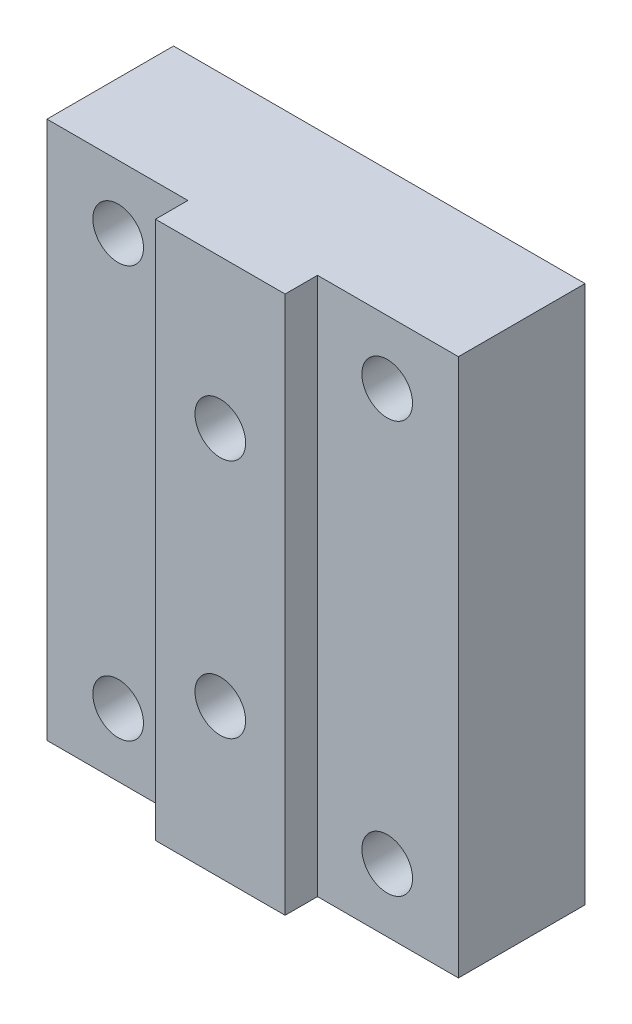
ISO-10303-21;
HEADER;
FILE_DESCRIPTION(('STEP AP214'),'2;1');
FILE_NAME('part.step','',(''),(''),'','','');
FILE_SCHEMA(('AUTOMOTIVE_DESIGN { 1 0 10303 214 1 1 1 1 }'));
ENDSEC;
DATA;
#1=APPLICATION_CONTEXT('core data for automotive mechanical design processes');
#2=APPLICATION_PROTOCOL_DEFINITION('international standard','automotive_design',2000,#1);
#3=PRODUCT_CONTEXT('',#1,'mechanical');
#4=PRODUCT('Part','Part','',(#3));
#5=PRODUCT_RELATED_PRODUCT_CATEGORY('part','',(#4));
#6=PRODUCT_DEFINITION_FORMATION('','',#4);
#7=PRODUCT_DEFINITION_CONTEXT('part definition',#1,'design');
#8=PRODUCT_DEFINITION('design','',#6,#7);
#9=PRODUCT_DEFINITION_SHAPE('','',#8);
#10=(LENGTH_UNIT() NAMED_UNIT(*) SI_UNIT(.MILLI.,.METRE.));
#11=(NAMED_UNIT(*) PLANE_ANGLE_UNIT() SI_UNIT($,.RADIAN.));
#12=(NAMED_UNIT(*) SI_UNIT($,.STERADIAN.) SOLID_ANGLE_UNIT());
#13=UNCERTAINTY_MEASURE_WITH_UNIT(LENGTH_MEASURE(1.E-05),#10,'distance_accuracy_value','');
#14=(GEOMETRIC_REPRESENTATION_CONTEXT(3) GLOBAL_UNCERTAINTY_ASSIGNED_CONTEXT((#13)) GLOBAL_UNIT_ASSIGNED_CONTEXT((#10,
#11,#12)) REPRESENTATION_CONTEXT('',''));
#15=CARTESIAN_POINT('',(0.,0.,0.));
#16=DIRECTION('',(0.,0.,1.));
#17=DIRECTION('',(1.,0.,0.));
#18=AXIS2_PLACEMENT_3D('',#15,#16,#17);
#19=CARTESIAN_POINT('',(0.,0.,508.));
#20=DIRECTION('',(0.,0.,1.));
#21=DIRECTION('',(1.,0.,0.));
#22=AXIS2_PLACEMENT_3D('',#19,#20,#21);
#23=PLANE('',#22);
#24=DIRECTION('',(0.,-1.,0.));
#25=VECTOR('',#24,1.);
#26=CARTESIAN_POINT('',(565.5,1.46096441265769E-13,508.));
#27=LINE('',#26,#25);
#28=CARTESIAN_POINT('',(565.5,2159.,508.));
#29=VERTEX_POINT('',#28);
#30=CARTESIAN_POINT('',(565.5,0.,508.));
#31=VERTEX_POINT('',#30);
#32=EDGE_CURVE('E53',#29,#31,#27,.T.);
#33=ORIENTED_EDGE('',*,*,#32,.F.);
#34=DIRECTION('',(-1.,0.,0.));
#35=VECTOR('',#34,1.);
#36=CARTESIAN_POINT('',(1651.,2159.,508.));
#37=LINE('',#36,#35);
#38=CARTESIAN_POINT('',(0.,2159.,508.));
#39=VERTEX_POINT('',#38);
#40=EDGE_CURVE('E183',#29,#39,#37,.T.);
#41=ORIENTED_EDGE('',*,*,#40,.T.);
#42=DIRECTION('',(0.,-1.,0.));
#43=VECTOR('',#42,1.);
#44=CARTESIAN_POINT('',(0.,2159.,508.));
#45=LINE('',#44,#43);
#46=CARTESIAN_POINT('',(0.,0.,508.));
#47=VERTEX_POINT('',#46);
#48=EDGE_CURVE('E159',#39,#47,#45,.T.);
#49=ORIENTED_EDGE('',*,*,#48,.T.);
#50=DIRECTION('',(1.,0.,0.));
#51=VECTOR('',#50,1.);
#52=CARTESIAN_POINT('',(0.,0.,508.));
#53=LINE('',#52,#51);
#54=EDGE_CURVE('E178',#47,#31,#53,.T.);
#55=ORIENTED_EDGE('',*,*,#54,.T.);
#56=EDGE_LOOP('',(#33,#41,#49,#55));
#57=FACE_BOUND('',#56,.T.);
#58=CARTESIAN_POINT('',(285.75,254.,508.));
#59=DIRECTION('',(0.,0.,1.));
#60=DIRECTION('',(-1.,0.,0.));
#61=AXIS2_PLACEMENT_3D('',#58,#59,#60);
#62=CIRCLE('',#61,101.6);
#63=CARTESIAN_POINT('',(184.15,254.,508.));
#64=VERTEX_POINT('',#63);
#65=EDGE_CURVE('E153',#64,#64,#62,.T.);
#66=ORIENTED_EDGE('',*,*,#65,.F.);
#67=EDGE_LOOP('',(#66));
#68=FACE_BOUND('',#67,.T.);
#69=CARTESIAN_POINT('',(285.75,1905.,508.));
#70=DIRECTION('',(0.,0.,1.));
#71=DIRECTION('',(-1.,0.,0.));
#72=AXIS2_PLACEMENT_3D('',#69,#70,#71);
#73=CIRCLE('',#72,101.6);
#74=CARTESIAN_POINT('',(184.15,1905.,508.));
#75=VERTEX_POINT('',#74);
#76=EDGE_CURVE('E138',#75,#75,#73,.T.);
#77=ORIENTED_EDGE('',*,*,#76,.F.);
#78=EDGE_LOOP('',(#77));
#79=FACE_BOUND('',#78,.T.);
#80=ADVANCED_FACE('F36',(#57,#68,#79),#23,.T.);
#81=CARTESIAN_POINT('',(0.,2159.,0.));
#82=DIRECTION('',(-1.,0.,0.));
#83=DIRECTION('',(0.,0.,1.));
#84=AXIS2_PLACEMENT_3D('',#81,#82,#83);
#85=PLANE('',#84);
#86=ORIENTED_EDGE('',*,*,#48,.F.);
#87=DIRECTION('',(0.,0.,1.));
#88=VECTOR('',#87,1.);
#89=CARTESIAN_POINT('',(0.,2159.,0.));
#90=LINE('',#89,#88);
#91=CARTESIAN_POINT('',(0.,2159.,0.));
#92=VERTEX_POINT('',#91);
#93=EDGE_CURVE('E11',#92,#39,#90,.T.);
#94=ORIENTED_EDGE('',*,*,#93,.F.);
#95=DIRECTION('',(0.,-1.,0.));
#96=VECTOR('',#95,1.);
#97=CARTESIAN_POINT('',(0.,2159.,0.));
#98=LINE('',#97,#96);
#99=CARTESIAN_POINT('',(0.,0.,0.));
#100=VERTEX_POINT('',#99);
#101=EDGE_CURVE('E162',#92,#100,#98,.T.);
#102=ORIENTED_EDGE('',*,*,#101,.T.);
#103=DIRECTION('',(0.,0.,1.));
#104=VECTOR('',#103,1.);
#105=CARTESIAN_POINT('',(0.,0.,0.));
#106=LINE('',#105,#104);
#107=EDGE_CURVE('E40',#100,#47,#106,.T.);
#108=ORIENTED_EDGE('',*,*,#107,.T.);
#109=EDGE_LOOP('',(#86,#94,#102,#108));
#110=FACE_BOUND('',#109,.T.);
#111=ADVANCED_FACE('F38',(#110),#85,.T.);
#112=CARTESIAN_POINT('',(1651.,2159.,0.));
#113=DIRECTION('',(0.,1.,0.));
#114=DIRECTION('',(0.,0.,1.));
#115=AXIS2_PLACEMENT_3D('',#112,#113,#114);
#116=PLANE('',#115);
#117=CARTESIAN_POINT('',(1651.,2159.,508.));
#118=VERTEX_POINT('',#117);
#119=CARTESIAN_POINT('',(1085.5,2159.,508.));
#120=VERTEX_POINT('',#119);
#121=EDGE_CURVE('E166',#118,#120,#37,.T.);
#122=ORIENTED_EDGE('',*,*,#121,.F.);
#123=DIRECTION('',(0.,0.,1.));
#124=VECTOR('',#123,1.);
#125=CARTESIAN_POINT('',(1651.,2159.,0.));
#126=LINE('',#125,#124);
#127=CARTESIAN_POINT('',(1651.,2159.,0.));
#128=VERTEX_POINT('',#127);
#129=EDGE_CURVE('E45',#128,#118,#126,.T.);
#130=ORIENTED_EDGE('',*,*,#129,.F.);
#131=DIRECTION('',(-1.,0.,0.));
#132=VECTOR('',#131,1.);
#133=CARTESIAN_POINT('',(1651.,2159.,0.));
#134=LINE('',#133,#132);
#135=EDGE_CURVE('E172',#128,#92,#134,.T.);
#136=ORIENTED_EDGE('',*,*,#135,.T.);
#137=ORIENTED_EDGE('',*,*,#93,.T.);
#138=ORIENTED_EDGE('',*,*,#40,.F.);
#139=DIRECTION('',(0.,0.,-1.));
#140=VECTOR('',#139,1.);
#141=CARTESIAN_POINT('',(565.5,2159.,638.));
#142=LINE('',#141,#140);
#143=CARTESIAN_POINT('',(565.5,2159.,638.));
#144=VERTEX_POINT('',#143);
#145=EDGE_CURVE('E207',#144,#29,#142,.T.);
#146=ORIENTED_EDGE('',*,*,#145,.F.);
#147=DIRECTION('',(-1.,0.,0.));
#148=VECTOR('',#147,1.);
#149=CARTESIAN_POINT('',(1085.5,2159.,638.));
#150=LINE('',#149,#148);
#151=CARTESIAN_POINT('',(1085.5,2159.,638.));
#152=VERTEX_POINT('',#151);
#153=EDGE_CURVE('E120',#152,#144,#150,.T.);
#154=ORIENTED_EDGE('',*,*,#153,.F.);
#155=DIRECTION('',(0.,0.,-1.));
#156=VECTOR('',#155,1.);
#157=CARTESIAN_POINT('',(1085.5,2159.,638.));
#158=LINE('',#157,#156);
#159=EDGE_CURVE('E131',#152,#120,#158,.T.);
#160=ORIENTED_EDGE('',*,*,#159,.T.);
#161=EDGE_LOOP('',(#122,#130,#136,#137,#138,#146,#154,#160));
#162=FACE_BOUND('',#161,.T.);
#163=ADVANCED_FACE('F195',(#162),#116,.T.);
#164=CARTESIAN_POINT('',(1651.,0.,0.));
#165=DIRECTION('',(1.,0.,0.));
#166=DIRECTION('',(0.,0.,-1.));
#167=AXIS2_PLACEMENT_3D('',#164,#165,#166);
#168=PLANE('',#167);
#169=DIRECTION('',(0.,1.,0.));
#170=VECTOR('',#169,1.);
#171=CARTESIAN_POINT('',(1651.,0.,508.));
#172=LINE('',#171,#170);
#173=CARTESIAN_POINT('',(1651.,0.,508.));
#174=VERTEX_POINT('',#173);
#175=EDGE_CURVE('E180',#174,#118,#172,.T.);
#176=ORIENTED_EDGE('',*,*,#175,.F.);
#177=DIRECTION('',(0.,0.,1.));
#178=VECTOR('',#177,1.);
#179=CARTESIAN_POINT('',(1651.,0.,0.));
#180=LINE('',#179,#178);
#181=CARTESIAN_POINT('',(1651.,0.,0.));
#182=VERTEX_POINT('',#181);
#183=EDGE_CURVE('E185',#182,#174,#180,.T.);
#184=ORIENTED_EDGE('',*,*,#183,.F.);
#185=DIRECTION('',(0.,1.,0.));
#186=VECTOR('',#185,1.);
#187=CARTESIAN_POINT('',(1651.,0.,0.));
#188=LINE('',#187,#186);
#189=EDGE_CURVE('E169',#182,#128,#188,.T.);
#190=ORIENTED_EDGE('',*,*,#189,.T.);
#191=ORIENTED_EDGE('',*,*,#129,.T.);
#192=EDGE_LOOP('',(#176,#184,#190,#191));
#193=FACE_BOUND('',#192,.T.);
#194=ADVANCED_FACE('F201',(#193),#168,.T.);
#195=CARTESIAN_POINT('',(0.,0.,0.));
#196=DIRECTION('',(0.,-1.,0.));
#197=DIRECTION('',(0.,0.,-1.));
#198=AXIS2_PLACEMENT_3D('',#195,#196,#197);
#199=PLANE('',#198);
#200=ORIENTED_EDGE('',*,*,#54,.F.);
#201=ORIENTED_EDGE('',*,*,#107,.F.);
#202=DIRECTION('',(1.,0.,0.));
#203=VECTOR('',#202,1.);
#204=CARTESIAN_POINT('',(0.,0.,0.));
#205=LINE('',#204,#203);
#206=EDGE_CURVE('E165',#100,#182,#205,.T.);
#207=ORIENTED_EDGE('',*,*,#206,.T.);
#208=ORIENTED_EDGE('',*,*,#183,.T.);
#209=CARTESIAN_POINT('',(1085.5,0.,508.));
#210=VERTEX_POINT('',#209);
#211=EDGE_CURVE('E177',#210,#174,#53,.T.);
#212=ORIENTED_EDGE('',*,*,#211,.F.);
#213=DIRECTION('',(0.,0.,-1.));
#214=VECTOR('',#213,1.);
#215=CARTESIAN_POINT('',(1085.5,1.46096440438588E-13,638.));
#216=LINE('',#215,#214);
#217=CARTESIAN_POINT('',(1085.5,1.46096440438588E-13,638.));
#218=VERTEX_POINT('',#217);
#219=EDGE_CURVE('E110',#218,#210,#216,.T.);
#220=ORIENTED_EDGE('',*,*,#219,.F.);
#221=DIRECTION('',(1.,0.,0.));
#222=VECTOR('',#221,1.);
#223=CARTESIAN_POINT('',(1085.5,1.46096440438588E-13,638.));
#224=LINE('',#223,#222);
#225=CARTESIAN_POINT('',(565.5,1.46096441265769E-13,638.));
#226=VERTEX_POINT('',#225);
#227=EDGE_CURVE('E103',#226,#218,#224,.T.);
#228=ORIENTED_EDGE('',*,*,#227,.F.);
#229=DIRECTION('',(0.,0.,-1.));
#230=VECTOR('',#229,1.);
#231=CARTESIAN_POINT('',(565.5,1.46096441265769E-13,638.));
#232=LINE('',#231,#230);
#233=EDGE_CURVE('E108',#226,#31,#232,.T.);
#234=ORIENTED_EDGE('',*,*,#233,.T.);
#235=EDGE_LOOP('',(#200,#201,#207,#208,#212,#220,#228,#234));
#236=FACE_BOUND('',#235,.T.);
#237=ADVANCED_FACE('F106',(#236),#199,.T.);
#238=CARTESIAN_POINT('',(0.,0.,0.));
#239=DIRECTION('',(0.,0.,1.));
#240=DIRECTION('',(1.,0.,0.));
#241=AXIS2_PLACEMENT_3D('',#238,#239,#240);
#242=PLANE('',#241);
#243=CARTESIAN_POINT('',(825.5,596.9,0.));
#244=DIRECTION('',(0.,0.,1.));
#245=DIRECTION('',(-1.,0.,0.));
#246=AXIS2_PLACEMENT_3D('',#243,#244,#245);
#247=CIRCLE('',#246,101.6);
#248=CARTESIAN_POINT('',(723.9,596.9,0.));
#249=VERTEX_POINT('',#248);
#250=EDGE_CURVE('E126',#249,#249,#247,.T.);
#251=ORIENTED_EDGE('',*,*,#250,.T.);
#252=EDGE_LOOP('',(#251));
#253=FACE_BOUND('',#252,.T.);
#254=CARTESIAN_POINT('',(1365.25,254.,0.));
#255=DIRECTION('',(0.,0.,1.));
#256=DIRECTION('',(-1.,0.,0.));
#257=AXIS2_PLACEMENT_3D('',#254,#255,#256);
#258=CIRCLE('',#257,101.6);
#259=CARTESIAN_POINT('',(1263.65,254.,0.));
#260=VERTEX_POINT('',#259);
#261=EDGE_CURVE('E135',#260,#260,#258,.T.);
#262=ORIENTED_EDGE('',*,*,#261,.T.);
#263=EDGE_LOOP('',(#262));
#264=FACE_BOUND('',#263,.T.);
#265=CARTESIAN_POINT('',(285.75,1905.,0.));
#266=DIRECTION('',(0.,0.,1.));
#267=DIRECTION('',(-1.,0.,0.));
#268=AXIS2_PLACEMENT_3D('',#265,#266,#267);
#269=CIRCLE('',#268,101.6);
#270=CARTESIAN_POINT('',(184.15,1905.,0.));
#271=VERTEX_POINT('',#270);
#272=EDGE_CURVE('E141',#271,#271,#269,.T.);
#273=ORIENTED_EDGE('',*,*,#272,.T.);
#274=EDGE_LOOP('',(#273));
#275=FACE_BOUND('',#274,.T.);
#276=CARTESIAN_POINT('',(825.5,1562.1,0.));
#277=DIRECTION('',(0.,0.,1.));
#278=DIRECTION('',(-1.,0.,0.));
#279=AXIS2_PLACEMENT_3D('',#276,#277,#278);
#280=CIRCLE('',#279,101.6);
#281=CARTESIAN_POINT('',(723.9,1562.1,0.));
#282=VERTEX_POINT('',#281);
#283=EDGE_CURVE('E144',#282,#282,#280,.T.);
#284=ORIENTED_EDGE('',*,*,#283,.T.);
#285=EDGE_LOOP('',(#284));
#286=FACE_BOUND('',#285,.T.);
#287=CARTESIAN_POINT('',(1365.25,1905.,0.));
#288=DIRECTION('',(0.,0.,1.));
#289=DIRECTION('',(-1.,0.,0.));
#290=AXIS2_PLACEMENT_3D('',#287,#288,#289);
#291=CIRCLE('',#290,101.6);
#292=CARTESIAN_POINT('',(1263.65,1905.,0.));
#293=VERTEX_POINT('',#292);
#294=EDGE_CURVE('E150',#293,#293,#291,.T.);
#295=ORIENTED_EDGE('',*,*,#294,.T.);
#296=EDGE_LOOP('',(#295));
#297=FACE_BOUND('',#296,.T.);
#298=CARTESIAN_POINT('',(285.75,254.,0.));
#299=DIRECTION('',(0.,0.,1.));
#300=DIRECTION('',(-1.,0.,0.));
#301=AXIS2_PLACEMENT_3D('',#298,#299,#300);
#302=CIRCLE('',#301,101.6);
#303=CARTESIAN_POINT('',(184.15,254.,0.));
#304=VERTEX_POINT('',#303);
#305=EDGE_CURVE('E156',#304,#304,#302,.T.);
#306=ORIENTED_EDGE('',*,*,#305,.T.);
#307=EDGE_LOOP('',(#306));
#308=FACE_BOUND('',#307,.T.);
#309=ORIENTED_EDGE('',*,*,#101,.F.);
#310=ORIENTED_EDGE('',*,*,#135,.F.);
#311=ORIENTED_EDGE('',*,*,#189,.F.);
#312=ORIENTED_EDGE('',*,*,#206,.F.);
#313=EDGE_LOOP('',(#309,#310,#311,#312));
#314=FACE_BOUND('',#313,.T.);
#315=ADVANCED_FACE('F198',(#253,#264,#275,#286,#297,#308,#314),#242,.F.);
#316=DIRECTION('',(0.,1.,0.));
#317=VECTOR('',#316,1.);
#318=CARTESIAN_POINT('',(1085.5,1.46096440438588E-13,508.));
#319=LINE('',#318,#317);
#320=EDGE_CURVE('E61',#210,#120,#319,.T.);
#321=ORIENTED_EDGE('',*,*,#320,.F.);
#322=ORIENTED_EDGE('',*,*,#211,.T.);
#323=ORIENTED_EDGE('',*,*,#175,.T.);
#324=ORIENTED_EDGE('',*,*,#121,.T.);
#325=EDGE_LOOP('',(#321,#322,#323,#324));
#326=FACE_BOUND('',#325,.T.);
#327=CARTESIAN_POINT('',(1365.25,254.,508.));
#328=DIRECTION('',(0.,0.,1.));
#329=DIRECTION('',(-1.,0.,0.));
#330=AXIS2_PLACEMENT_3D('',#327,#328,#329);
#331=CIRCLE('',#330,101.6);
#332=CARTESIAN_POINT('',(1263.65,254.,508.));
#333=VERTEX_POINT('',#332);
#334=EDGE_CURVE('E129',#333,#333,#331,.T.);
#335=ORIENTED_EDGE('',*,*,#334,.F.);
#336=EDGE_LOOP('',(#335));
#337=FACE_BOUND('',#336,.T.);
#338=CARTESIAN_POINT('',(1365.25,1905.,508.));
#339=DIRECTION('',(0.,0.,1.));
#340=DIRECTION('',(-1.,0.,0.));
#341=AXIS2_PLACEMENT_3D('',#338,#339,#340);
#342=CIRCLE('',#341,101.6);
#343=CARTESIAN_POINT('',(1263.65,1905.,508.));
#344=VERTEX_POINT('',#343);
#345=EDGE_CURVE('E149',#344,#344,#342,.T.);
#346=ORIENTED_EDGE('',*,*,#345,.F.);
#347=EDGE_LOOP('',(#346));
#348=FACE_BOUND('',#347,.T.);
#349=ADVANCED_FACE('F202',(#326,#337,#348),#23,.T.);
#350=CARTESIAN_POINT('',(285.75,254.,0.));
#351=DIRECTION('',(0.,0.,1.));
#352=DIRECTION('',(1.,0.,0.));
#353=AXIS2_PLACEMENT_3D('',#350,#351,#352);
#354=CYLINDRICAL_SURFACE('',#353,101.6);
#355=ORIENTED_EDGE('',*,*,#305,.F.);
#356=EDGE_LOOP('',(#355));
#357=FACE_BOUND('',#356,.T.);
#358=ORIENTED_EDGE('',*,*,#65,.T.);
#359=EDGE_LOOP('',(#358));
#360=FACE_BOUND('',#359,.T.);
#361=ADVANCED_FACE('F245',(#357,#360),#354,.F.);
#362=CARTESIAN_POINT('',(1365.25,1905.,0.));
#363=DIRECTION('',(0.,0.,1.));
#364=DIRECTION('',(1.,0.,0.));
#365=AXIS2_PLACEMENT_3D('',#362,#363,#364);
#366=CYLINDRICAL_SURFACE('',#365,101.6);
#367=ORIENTED_EDGE('',*,*,#294,.F.);
#368=EDGE_LOOP('',(#367));
#369=FACE_BOUND('',#368,.T.);
#370=ORIENTED_EDGE('',*,*,#345,.T.);
#371=EDGE_LOOP('',(#370));
#372=FACE_BOUND('',#371,.T.);
#373=ADVANCED_FACE('F250',(#369,#372),#366,.F.);
#374=CARTESIAN_POINT('',(825.5,1562.1,0.));
#375=DIRECTION('',(0.,0.,1.));
#376=DIRECTION('',(1.,0.,0.));
#377=AXIS2_PLACEMENT_3D('',#374,#375,#376);
#378=CYLINDRICAL_SURFACE('',#377,101.6);
#379=ORIENTED_EDGE('',*,*,#283,.F.);
#380=EDGE_LOOP('',(#379));
#381=FACE_BOUND('',#380,.T.);
#382=CARTESIAN_POINT('',(825.5,1562.1,638.));
#383=DIRECTION('',(0.,0.,1.));
#384=DIRECTION('',(1.,0.,0.));
#385=AXIS2_PLACEMENT_3D('',#382,#383,#384);
#386=CIRCLE('',#385,101.6);
#387=CARTESIAN_POINT('',(927.1,1562.1,638.));
#388=VERTEX_POINT('',#387);
#389=EDGE_CURVE('E217',#388,#388,#386,.T.);
#390=ORIENTED_EDGE('',*,*,#389,.T.);
#391=EDGE_LOOP('',(#390));
#392=FACE_BOUND('',#391,.T.);
#393=ADVANCED_FACE('F221',(#381,#392),#378,.F.);
#394=CARTESIAN_POINT('',(285.75,1905.,0.));
#395=DIRECTION('',(0.,0.,1.));
#396=DIRECTION('',(1.,0.,0.));
#397=AXIS2_PLACEMENT_3D('',#394,#395,#396);
#398=CYLINDRICAL_SURFACE('',#397,101.6);
#399=ORIENTED_EDGE('',*,*,#272,.F.);
#400=EDGE_LOOP('',(#399));
#401=FACE_BOUND('',#400,.T.);
#402=ORIENTED_EDGE('',*,*,#76,.T.);
#403=EDGE_LOOP('',(#402));
#404=FACE_BOUND('',#403,.T.);
#405=ADVANCED_FACE('F264',(#401,#404),#398,.F.);
#406=CARTESIAN_POINT('',(1365.25,254.,0.));
#407=DIRECTION('',(0.,0.,1.));
#408=DIRECTION('',(1.,0.,0.));
#409=AXIS2_PLACEMENT_3D('',#406,#407,#408);
#410=CYLINDRICAL_SURFACE('',#409,101.6);
#411=ORIENTED_EDGE('',*,*,#261,.F.);
#412=EDGE_LOOP('',(#411));
#413=FACE_BOUND('',#412,.T.);
#414=ORIENTED_EDGE('',*,*,#334,.T.);
#415=EDGE_LOOP('',(#414));
#416=FACE_BOUND('',#415,.T.);
#417=ADVANCED_FACE('F232',(#413,#416),#410,.F.);
#418=CARTESIAN_POINT('',(825.5,596.9,0.));
#419=DIRECTION('',(0.,0.,1.));
#420=DIRECTION('',(1.,0.,0.));
#421=AXIS2_PLACEMENT_3D('',#418,#419,#420);
#422=CYLINDRICAL_SURFACE('',#421,101.6);
#423=ORIENTED_EDGE('',*,*,#250,.F.);
#424=EDGE_LOOP('',(#423));
#425=FACE_BOUND('',#424,.T.);
#426=CARTESIAN_POINT('',(825.5,596.9,638.));
#427=DIRECTION('',(0.,0.,1.));
#428=DIRECTION('',(1.,0.,0.));
#429=AXIS2_PLACEMENT_3D('',#426,#427,#428);
#430=CIRCLE('',#429,101.6);
#431=CARTESIAN_POINT('',(927.1,596.9,638.));
#432=VERTEX_POINT('',#431);
#433=EDGE_CURVE('E212',#432,#432,#430,.T.);
#434=ORIENTED_EDGE('',*,*,#433,.T.);
#435=EDGE_LOOP('',(#434));
#436=FACE_BOUND('',#435,.T.);
#437=ADVANCED_FACE('F223',(#425,#436),#422,.F.);
#438=CARTESIAN_POINT('',(0.,0.,638.));
#439=DIRECTION('',(0.,0.,1.));
#440=DIRECTION('',(1.,0.,0.));
#441=AXIS2_PLACEMENT_3D('',#438,#439,#440);
#442=PLANE('',#441);
#443=ORIENTED_EDGE('',*,*,#433,.F.);
#444=EDGE_LOOP('',(#443));
#445=FACE_BOUND('',#444,.T.);
#446=DIRECTION('',(0.,-1.,0.));
#447=VECTOR('',#446,1.);
#448=CARTESIAN_POINT('',(565.5,1.46096441265769E-13,638.));
#449=LINE('',#448,#447);
#450=EDGE_CURVE('E114',#144,#226,#449,.T.);
#451=ORIENTED_EDGE('',*,*,#450,.T.);
#452=ORIENTED_EDGE('',*,*,#227,.T.);
#453=DIRECTION('',(0.,1.,0.));
#454=VECTOR('',#453,1.);
#455=CARTESIAN_POINT('',(1085.5,1.46096440438588E-13,638.));
#456=LINE('',#455,#454);
#457=EDGE_CURVE('E113',#218,#152,#456,.T.);
#458=ORIENTED_EDGE('',*,*,#457,.T.);
#459=ORIENTED_EDGE('',*,*,#153,.T.);
#460=EDGE_LOOP('',(#451,#452,#458,#459));
#461=FACE_BOUND('',#460,.T.);
#462=ORIENTED_EDGE('',*,*,#389,.F.);
#463=EDGE_LOOP('',(#462));
#464=FACE_BOUND('',#463,.T.);
#465=ADVANCED_FACE('F117',(#445,#461,#464),#442,.T.);
#466=CARTESIAN_POINT('',(565.5,1.46096441265769E-13,638.));
#467=DIRECTION('',(1.,0.,0.));
#468=DIRECTION('',(0.,0.,-1.));
#469=AXIS2_PLACEMENT_3D('',#466,#467,#468);
#470=PLANE('',#469);
#471=ORIENTED_EDGE('',*,*,#32,.T.);
#472=ORIENTED_EDGE('',*,*,#233,.F.);
#473=ORIENTED_EDGE('',*,*,#450,.F.);
#474=ORIENTED_EDGE('',*,*,#145,.T.);
#475=EDGE_LOOP('',(#471,#472,#473,#474));
#476=FACE_BOUND('',#475,.T.);
#477=ADVANCED_FACE('F125',(#476),#470,.F.);
#478=CARTESIAN_POINT('',(1085.5,1.46096440438588E-13,638.));
#479=DIRECTION('',(-1.,0.,0.));
#480=DIRECTION('',(0.,0.,1.));
#481=AXIS2_PLACEMENT_3D('',#478,#479,#480);
#482=PLANE('',#481);
#483=ORIENTED_EDGE('',*,*,#320,.T.);
#484=ORIENTED_EDGE('',*,*,#159,.F.);
#485=ORIENTED_EDGE('',*,*,#457,.F.);
#486=ORIENTED_EDGE('',*,*,#219,.T.);
#487=EDGE_LOOP('',(#483,#484,#485,#486));
#488=FACE_BOUND('',#487,.T.);
#489=ADVANCED_FACE('F230',(#488),#482,.F.);
#490=CLOSED_SHELL('',(#80,#111,#163,#194,#237,#315,#349,#361,#373,#393,#405,#417,#437,#465,#477,#489));
#491=MANIFOLD_SOLID_BREP('B2',#490);
#492=ADVANCED_BREP_SHAPE_REPRESENTATION('',(#18,#491),#14);
#493=SHAPE_DEFINITION_REPRESENTATION(#9,#492);
ENDSEC;
END-ISO-10303-21;
